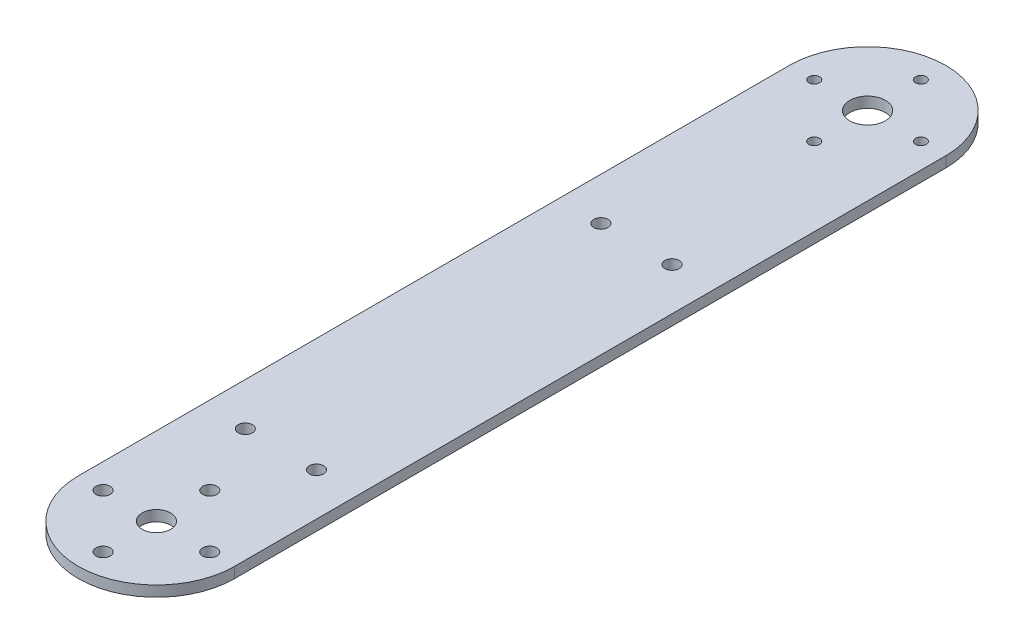
ISO-10303-21;
HEADER;
FILE_DESCRIPTION(('STEP AP214'),'2;1');
FILE_NAME('part.step','',(''),(''),'','','');
FILE_SCHEMA(('AUTOMOTIVE_DESIGN { 1 0 10303 214 1 1 1 1 }'));
ENDSEC;
DATA;
#1=APPLICATION_CONTEXT('core data for automotive mechanical design processes');
#2=APPLICATION_PROTOCOL_DEFINITION('international standard','automotive_design',2000,#1);
#3=PRODUCT_CONTEXT('',#1,'mechanical');
#4=PRODUCT('Part','Part','',(#3));
#5=PRODUCT_RELATED_PRODUCT_CATEGORY('part','',(#4));
#6=PRODUCT_DEFINITION_FORMATION('','',#4);
#7=PRODUCT_DEFINITION_CONTEXT('part definition',#1,'design');
#8=PRODUCT_DEFINITION('design','',#6,#7);
#9=PRODUCT_DEFINITION_SHAPE('','',#8);
#10=(LENGTH_UNIT() NAMED_UNIT(*) SI_UNIT(.MILLI.,.METRE.));
#11=(NAMED_UNIT(*) PLANE_ANGLE_UNIT() SI_UNIT($,.RADIAN.));
#12=(NAMED_UNIT(*) SI_UNIT($,.STERADIAN.) SOLID_ANGLE_UNIT());
#13=UNCERTAINTY_MEASURE_WITH_UNIT(LENGTH_MEASURE(1.E-05),#10,'distance_accuracy_value','');
#14=(GEOMETRIC_REPRESENTATION_CONTEXT(3) GLOBAL_UNCERTAINTY_ASSIGNED_CONTEXT((#13)) GLOBAL_UNIT_ASSIGNED_CONTEXT((#10,
#11,#12)) REPRESENTATION_CONTEXT('',''));
#15=CARTESIAN_POINT('',(0.,0.,0.));
#16=DIRECTION('',(0.,0.,1.));
#17=DIRECTION('',(1.,0.,0.));
#18=AXIS2_PLACEMENT_3D('',#15,#16,#17);
#19=CARTESIAN_POINT('',(0.,-3.,-200.));
#20=DIRECTION('',(0.,1.,0.));
#21=DIRECTION('',(0.,0.,1.));
#22=AXIS2_PLACEMENT_3D('',#19,#20,#21);
#23=CYLINDRICAL_SURFACE('',#22,22.);
#24=CARTESIAN_POINT('',(0.,0.,-200.));
#25=DIRECTION('',(0.,1.,0.));
#26=DIRECTION('',(0.,0.,1.));
#27=AXIS2_PLACEMENT_3D('',#24,#25,#26);
#28=CIRCLE('',#27,22.);
#29=CARTESIAN_POINT('',(22.,0.,-200.));
#30=VERTEX_POINT('',#29);
#31=CARTESIAN_POINT('',(-22.,0.,-200.));
#32=VERTEX_POINT('',#31);
#33=EDGE_CURVE('E101',#30,#32,#28,.T.);
#34=ORIENTED_EDGE('',*,*,#33,.F.);
#35=DIRECTION('',(0.,1.,0.));
#36=VECTOR('',#35,1.);
#37=CARTESIAN_POINT('',(22.,-3.,-200.));
#38=LINE('',#37,#36);
#39=CARTESIAN_POINT('',(22.,-3.,-200.));
#40=VERTEX_POINT('',#39);
#41=EDGE_CURVE('E11',#40,#30,#38,.T.);
#42=ORIENTED_EDGE('',*,*,#41,.F.);
#43=CARTESIAN_POINT('',(0.,-3.,-200.));
#44=DIRECTION('',(0.,1.,0.));
#45=DIRECTION('',(0.,0.,1.));
#46=AXIS2_PLACEMENT_3D('',#43,#44,#45);
#47=CIRCLE('',#46,22.);
#48=CARTESIAN_POINT('',(-22.,-3.,-200.));
#49=VERTEX_POINT('',#48);
#50=EDGE_CURVE('E94',#40,#49,#47,.T.);
#51=ORIENTED_EDGE('',*,*,#50,.T.);
#52=DIRECTION('',(0.,1.,0.));
#53=VECTOR('',#52,1.);
#54=CARTESIAN_POINT('',(-22.,-3.,-200.));
#55=LINE('',#54,#53);
#56=EDGE_CURVE('E39',#49,#32,#55,.T.);
#57=ORIENTED_EDGE('',*,*,#56,.T.);
#58=EDGE_LOOP('',(#34,#42,#51,#57));
#59=FACE_BOUND('',#58,.T.);
#60=ADVANCED_FACE('F36',(#59),#23,.T.);
#61=CARTESIAN_POINT('',(22.,-3.,-200.));
#62=DIRECTION('',(1.,0.,0.));
#63=DIRECTION('',(0.,0.,-1.));
#64=AXIS2_PLACEMENT_3D('',#61,#62,#63);
#65=PLANE('',#64);
#66=DIRECTION('',(0.,0.,-1.));
#67=VECTOR('',#66,1.);
#68=CARTESIAN_POINT('',(22.,0.,-200.));
#69=LINE('',#68,#67);
#70=CARTESIAN_POINT('',(22.,0.,0.));
#71=VERTEX_POINT('',#70);
#72=EDGE_CURVE('E96',#71,#30,#69,.T.);
#73=ORIENTED_EDGE('',*,*,#72,.F.);
#74=DIRECTION('',(0.,1.,0.));
#75=VECTOR('',#74,1.);
#76=CARTESIAN_POINT('',(22.,-3.,0.));
#77=LINE('',#76,#75);
#78=CARTESIAN_POINT('',(22.,-3.,0.));
#79=VERTEX_POINT('',#78);
#80=EDGE_CURVE('E45',#79,#71,#77,.T.);
#81=ORIENTED_EDGE('',*,*,#80,.F.);
#82=DIRECTION('',(0.,0.,-1.));
#83=VECTOR('',#82,1.);
#84=CARTESIAN_POINT('',(22.,-3.,-200.));
#85=LINE('',#84,#83);
#86=EDGE_CURVE('E91',#79,#40,#85,.T.);
#87=ORIENTED_EDGE('',*,*,#86,.T.);
#88=ORIENTED_EDGE('',*,*,#41,.T.);
#89=EDGE_LOOP('',(#73,#81,#87,#88));
#90=FACE_BOUND('',#89,.T.);
#91=ADVANCED_FACE('F112',(#90),#65,.T.);
#92=CARTESIAN_POINT('',(0.,-3.,0.));
#93=DIRECTION('',(0.,1.,0.));
#94=DIRECTION('',(0.,0.,1.));
#95=AXIS2_PLACEMENT_3D('',#92,#93,#94);
#96=CYLINDRICAL_SURFACE('',#95,22.);
#97=CARTESIAN_POINT('',(0.,0.,0.));
#98=DIRECTION('',(0.,1.,0.));
#99=DIRECTION('',(0.,0.,1.));
#100=AXIS2_PLACEMENT_3D('',#97,#98,#99);
#101=CIRCLE('',#100,22.);
#102=CARTESIAN_POINT('',(-22.,0.,0.));
#103=VERTEX_POINT('',#102);
#104=EDGE_CURVE('E86',#103,#71,#101,.T.);
#105=ORIENTED_EDGE('',*,*,#104,.F.);
#106=DIRECTION('',(0.,1.,0.));
#107=VECTOR('',#106,1.);
#108=CARTESIAN_POINT('',(-22.,-3.,0.));
#109=LINE('',#108,#107);
#110=CARTESIAN_POINT('',(-22.,-3.,0.));
#111=VERTEX_POINT('',#110);
#112=EDGE_CURVE('E81',#111,#103,#109,.T.);
#113=ORIENTED_EDGE('',*,*,#112,.F.);
#114=CARTESIAN_POINT('',(0.,-3.,0.));
#115=DIRECTION('',(0.,1.,0.));
#116=DIRECTION('',(0.,0.,1.));
#117=AXIS2_PLACEMENT_3D('',#114,#115,#116);
#118=CIRCLE('',#117,22.);
#119=EDGE_CURVE('E84',#111,#79,#118,.T.);
#120=ORIENTED_EDGE('',*,*,#119,.T.);
#121=ORIENTED_EDGE('',*,*,#80,.T.);
#122=EDGE_LOOP('',(#105,#113,#120,#121));
#123=FACE_BOUND('',#122,.T.);
#124=ADVANCED_FACE('F83',(#123),#96,.T.);
#125=CARTESIAN_POINT('',(-22.,-3.,0.));
#126=DIRECTION('',(-1.,0.,0.));
#127=DIRECTION('',(0.,0.,1.));
#128=AXIS2_PLACEMENT_3D('',#125,#126,#127);
#129=PLANE('',#128);
#130=DIRECTION('',(0.,0.,1.));
#131=VECTOR('',#130,1.);
#132=CARTESIAN_POINT('',(-22.,0.,0.));
#133=LINE('',#132,#131);
#134=EDGE_CURVE('E104',#32,#103,#133,.T.);
#135=ORIENTED_EDGE('',*,*,#134,.F.);
#136=ORIENTED_EDGE('',*,*,#56,.F.);
#137=DIRECTION('',(0.,0.,1.));
#138=VECTOR('',#137,1.);
#139=CARTESIAN_POINT('',(-22.,-3.,0.));
#140=LINE('',#139,#138);
#141=EDGE_CURVE('E90',#49,#111,#140,.T.);
#142=ORIENTED_EDGE('',*,*,#141,.T.);
#143=ORIENTED_EDGE('',*,*,#112,.T.);
#144=EDGE_LOOP('',(#135,#136,#142,#143));
#145=FACE_BOUND('',#144,.T.);
#146=ADVANCED_FACE('F93',(#145),#129,.T.);
#147=CARTESIAN_POINT('',(0.,-3.,-200.));
#148=DIRECTION('',(0.,1.,0.));
#149=DIRECTION('',(0.,0.,1.));
#150=AXIS2_PLACEMENT_3D('',#147,#148,#149);
#151=PLANE('',#150);
#152=CARTESIAN_POINT('',(-15.,-3.,-1.57116660247941E-13));
#153=DIRECTION('',(0.,1.,0.));
#154=DIRECTION('',(0.,0.,1.));
#155=AXIS2_PLACEMENT_3D('',#152,#153,#154);
#156=CIRCLE('',#155,2.);
#157=CARTESIAN_POINT('',(-15.,-3.,1.99999999999984));
#158=VERTEX_POINT('',#157);
#159=EDGE_CURVE('E193',#158,#158,#156,.T.);
#160=ORIENTED_EDGE('',*,*,#159,.T.);
#161=EDGE_LOOP('',(#160));
#162=FACE_BOUND('',#161,.T.);
#163=CARTESIAN_POINT('',(-1.04744440165294E-13,-3.,15.));
#164=DIRECTION('',(0.,1.,0.));
#165=DIRECTION('',(0.,0.,1.));
#166=AXIS2_PLACEMENT_3D('',#163,#164,#165);
#167=CIRCLE('',#166,2.);
#168=CARTESIAN_POINT('',(-1.04744440165294E-13,-3.,17.));
#169=VERTEX_POINT('',#168);
#170=EDGE_CURVE('E201',#169,#169,#167,.T.);
#171=ORIENTED_EDGE('',*,*,#170,.T.);
#172=EDGE_LOOP('',(#171));
#173=FACE_BOUND('',#172,.T.);
#174=CARTESIAN_POINT('',(15.,-3.,0.));
#175=DIRECTION('',(0.,1.,0.));
#176=DIRECTION('',(0.,0.,1.));
#177=AXIS2_PLACEMENT_3D('',#174,#175,#176);
#178=CIRCLE('',#177,2.);
#179=CARTESIAN_POINT('',(15.,-3.,2.00000000000005));
#180=VERTEX_POINT('',#179);
#181=EDGE_CURVE('E207',#180,#180,#178,.T.);
#182=ORIENTED_EDGE('',*,*,#181,.T.);
#183=EDGE_LOOP('',(#182));
#184=FACE_BOUND('',#183,.T.);
#185=CARTESIAN_POINT('',(-14.9999999999996,-3.,-200.));
#186=DIRECTION('',(0.,1.,0.));
#187=DIRECTION('',(0.,0.,1.));
#188=AXIS2_PLACEMENT_3D('',#185,#186,#187);
#189=CIRCLE('',#188,1.49999999999999);
#190=CARTESIAN_POINT('',(-14.9999999999996,-3.,-198.5));
#191=VERTEX_POINT('',#190);
#192=EDGE_CURVE('E213',#191,#191,#189,.T.);
#193=ORIENTED_EDGE('',*,*,#192,.T.);
#194=EDGE_LOOP('',(#193));
#195=FACE_BOUND('',#194,.T.);
#196=CARTESIAN_POINT('',(7.42954120482731E-13,-3.,-185.));
#197=DIRECTION('',(0.,1.,0.));
#198=DIRECTION('',(0.,0.,1.));
#199=AXIS2_PLACEMENT_3D('',#196,#197,#198);
#200=CIRCLE('',#199,1.5);
#201=CARTESIAN_POINT('',(7.42954120482731E-13,-3.,-183.5));
#202=VERTEX_POINT('',#201);
#203=EDGE_CURVE('E219',#202,#202,#200,.T.);
#204=ORIENTED_EDGE('',*,*,#203,.T.);
#205=EDGE_LOOP('',(#204));
#206=FACE_BOUND('',#205,.T.);
#207=CARTESIAN_POINT('',(15.0000000000004,-3.,-200.));
#208=DIRECTION('',(0.,1.,0.));
#209=DIRECTION('',(0.,0.,1.));
#210=AXIS2_PLACEMENT_3D('',#207,#208,#209);
#211=CIRCLE('',#210,1.5);
#212=CARTESIAN_POINT('',(15.0000000000004,-3.,-198.5));
#213=VERTEX_POINT('',#212);
#214=EDGE_CURVE('E225',#213,#213,#211,.T.);
#215=ORIENTED_EDGE('',*,*,#214,.T.);
#216=EDGE_LOOP('',(#215));
#217=FACE_BOUND('',#216,.T.);
#218=CARTESIAN_POINT('',(0.,-3.,-15.));
#219=DIRECTION('',(0.,1.,0.));
#220=DIRECTION('',(0.,0.,1.));
#221=AXIS2_PLACEMENT_3D('',#218,#219,#220);
#222=CIRCLE('',#221,2.);
#223=CARTESIAN_POINT('',(0.,-3.,-13.));
#224=VERTEX_POINT('',#223);
#225=EDGE_CURVE('E231',#224,#224,#222,.T.);
#226=ORIENTED_EDGE('',*,*,#225,.T.);
#227=EDGE_LOOP('',(#226));
#228=FACE_BOUND('',#227,.T.);
#229=CARTESIAN_POINT('',(0.,-3.,-215.));
#230=DIRECTION('',(0.,1.,0.));
#231=DIRECTION('',(0.,0.,1.));
#232=AXIS2_PLACEMENT_3D('',#229,#230,#231);
#233=CIRCLE('',#232,1.5);
#234=CARTESIAN_POINT('',(0.,-3.,-213.5));
#235=VERTEX_POINT('',#234);
#236=EDGE_CURVE('E237',#235,#235,#233,.T.);
#237=ORIENTED_EDGE('',*,*,#236,.T.);
#238=EDGE_LOOP('',(#237));
#239=FACE_BOUND('',#238,.T.);
#240=CARTESIAN_POINT('',(0.,-3.,-200.));
#241=DIRECTION('',(0.,1.,0.));
#242=DIRECTION('',(0.,0.,1.));
#243=AXIS2_PLACEMENT_3D('',#240,#241,#242);
#244=CIRCLE('',#243,5.);
#245=CARTESIAN_POINT('',(0.,-3.,-195.));
#246=VERTEX_POINT('',#245);
#247=EDGE_CURVE('E243',#246,#246,#244,.T.);
#248=ORIENTED_EDGE('',*,*,#247,.T.);
#249=EDGE_LOOP('',(#248));
#250=FACE_BOUND('',#249,.T.);
#251=CARTESIAN_POINT('',(9.99999999999999,-3.,-135.));
#252=DIRECTION('',(0.,1.,0.));
#253=DIRECTION('',(0.,0.,1.));
#254=AXIS2_PLACEMENT_3D('',#251,#252,#253);
#255=CIRCLE('',#254,2.);
#256=CARTESIAN_POINT('',(9.99999999999999,-3.,-133.));
#257=VERTEX_POINT('',#256);
#258=EDGE_CURVE('E249',#257,#257,#255,.T.);
#259=ORIENTED_EDGE('',*,*,#258,.T.);
#260=EDGE_LOOP('',(#259));
#261=FACE_BOUND('',#260,.T.);
#262=CARTESIAN_POINT('',(-10.,-3.,-135.));
#263=DIRECTION('',(0.,1.,0.));
#264=DIRECTION('',(0.,0.,1.));
#265=AXIS2_PLACEMENT_3D('',#262,#263,#264);
#266=CIRCLE('',#265,2.);
#267=CARTESIAN_POINT('',(-10.,-3.,-133.));
#268=VERTEX_POINT('',#267);
#269=EDGE_CURVE('E255',#268,#268,#266,.T.);
#270=ORIENTED_EDGE('',*,*,#269,.T.);
#271=EDGE_LOOP('',(#270));
#272=FACE_BOUND('',#271,.T.);
#273=CARTESIAN_POINT('',(10.,-3.,-35.));
#274=DIRECTION('',(0.,1.,0.));
#275=DIRECTION('',(0.,0.,1.));
#276=AXIS2_PLACEMENT_3D('',#273,#274,#275);
#277=CIRCLE('',#276,2.);
#278=CARTESIAN_POINT('',(10.,-3.,-33.));
#279=VERTEX_POINT('',#278);
#280=EDGE_CURVE('E261',#279,#279,#277,.T.);
#281=ORIENTED_EDGE('',*,*,#280,.T.);
#282=EDGE_LOOP('',(#281));
#283=FACE_BOUND('',#282,.T.);
#284=CARTESIAN_POINT('',(-10.,-3.,-35.));
#285=DIRECTION('',(0.,1.,0.));
#286=DIRECTION('',(0.,0.,1.));
#287=AXIS2_PLACEMENT_3D('',#284,#285,#286);
#288=CIRCLE('',#287,2.);
#289=CARTESIAN_POINT('',(-10.,-3.,-33.));
#290=VERTEX_POINT('',#289);
#291=EDGE_CURVE('E267',#290,#290,#288,.T.);
#292=ORIENTED_EDGE('',*,*,#291,.T.);
#293=EDGE_LOOP('',(#292));
#294=FACE_BOUND('',#293,.T.);
#295=CARTESIAN_POINT('',(0.,-3.,0.));
#296=DIRECTION('',(0.,1.,0.));
#297=DIRECTION('',(0.,0.,1.));
#298=AXIS2_PLACEMENT_3D('',#295,#296,#297);
#299=CIRCLE('',#298,4.);
#300=CARTESIAN_POINT('',(0.,-3.,4.));
#301=VERTEX_POINT('',#300);
#302=EDGE_CURVE('E105',#301,#301,#299,.T.);
#303=ORIENTED_EDGE('',*,*,#302,.T.);
#304=EDGE_LOOP('',(#303));
#305=FACE_BOUND('',#304,.T.);
#306=ORIENTED_EDGE('',*,*,#50,.F.);
#307=ORIENTED_EDGE('',*,*,#86,.F.);
#308=ORIENTED_EDGE('',*,*,#119,.F.);
#309=ORIENTED_EDGE('',*,*,#141,.F.);
#310=EDGE_LOOP('',(#306,#307,#308,#309));
#311=FACE_BOUND('',#310,.T.);
#312=ADVANCED_FACE('F89',(#162,#173,#184,#195,#206,#217,#228,#239,#250,#261,#272,#283,#294,#305,
#311),#151,.F.);
#313=CARTESIAN_POINT('',(0.,0.,-200.));
#314=DIRECTION('',(0.,1.,0.));
#315=DIRECTION('',(0.,0.,1.));
#316=AXIS2_PLACEMENT_3D('',#313,#314,#315);
#317=PLANE('',#316);
#318=CARTESIAN_POINT('',(-15.,0.,-1.57116660247941E-13));
#319=DIRECTION('',(0.,1.,0.));
#320=DIRECTION('',(0.,0.,1.));
#321=AXIS2_PLACEMENT_3D('',#318,#319,#320);
#322=CIRCLE('',#321,2.);
#323=CARTESIAN_POINT('',(-15.,0.,1.99999999999984));
#324=VERTEX_POINT('',#323);
#325=EDGE_CURVE('E196',#324,#324,#322,.T.);
#326=ORIENTED_EDGE('',*,*,#325,.F.);
#327=EDGE_LOOP('',(#326));
#328=FACE_BOUND('',#327,.T.);
#329=CARTESIAN_POINT('',(-1.04744440165294E-13,0.,15.));
#330=DIRECTION('',(0.,1.,0.));
#331=DIRECTION('',(0.,0.,1.));
#332=AXIS2_PLACEMENT_3D('',#329,#330,#331);
#333=CIRCLE('',#332,2.);
#334=CARTESIAN_POINT('',(-1.04744440165294E-13,0.,17.));
#335=VERTEX_POINT('',#334);
#336=EDGE_CURVE('E198',#335,#335,#333,.T.);
#337=ORIENTED_EDGE('',*,*,#336,.F.);
#338=EDGE_LOOP('',(#337));
#339=FACE_BOUND('',#338,.T.);
#340=CARTESIAN_POINT('',(15.,0.,0.));
#341=DIRECTION('',(0.,1.,0.));
#342=DIRECTION('',(0.,0.,1.));
#343=AXIS2_PLACEMENT_3D('',#340,#341,#342);
#344=CIRCLE('',#343,2.);
#345=CARTESIAN_POINT('',(15.,0.,2.00000000000005));
#346=VERTEX_POINT('',#345);
#347=EDGE_CURVE('E204',#346,#346,#344,.T.);
#348=ORIENTED_EDGE('',*,*,#347,.F.);
#349=EDGE_LOOP('',(#348));
#350=FACE_BOUND('',#349,.T.);
#351=CARTESIAN_POINT('',(-14.9999999999996,0.,-200.));
#352=DIRECTION('',(0.,1.,0.));
#353=DIRECTION('',(0.,0.,1.));
#354=AXIS2_PLACEMENT_3D('',#351,#352,#353);
#355=CIRCLE('',#354,1.49999999999999);
#356=CARTESIAN_POINT('',(-14.9999999999996,0.,-198.5));
#357=VERTEX_POINT('',#356);
#358=EDGE_CURVE('E210',#357,#357,#355,.T.);
#359=ORIENTED_EDGE('',*,*,#358,.F.);
#360=EDGE_LOOP('',(#359));
#361=FACE_BOUND('',#360,.T.);
#362=CARTESIAN_POINT('',(7.42954120482731E-13,0.,-185.));
#363=DIRECTION('',(0.,1.,0.));
#364=DIRECTION('',(0.,0.,1.));
#365=AXIS2_PLACEMENT_3D('',#362,#363,#364);
#366=CIRCLE('',#365,1.5);
#367=CARTESIAN_POINT('',(7.42954120482731E-13,0.,-183.5));
#368=VERTEX_POINT('',#367);
#369=EDGE_CURVE('E216',#368,#368,#366,.T.);
#370=ORIENTED_EDGE('',*,*,#369,.F.);
#371=EDGE_LOOP('',(#370));
#372=FACE_BOUND('',#371,.T.);
#373=CARTESIAN_POINT('',(15.0000000000004,0.,-200.));
#374=DIRECTION('',(0.,1.,0.));
#375=DIRECTION('',(0.,0.,1.));
#376=AXIS2_PLACEMENT_3D('',#373,#374,#375);
#377=CIRCLE('',#376,1.5);
#378=CARTESIAN_POINT('',(15.0000000000004,0.,-198.5));
#379=VERTEX_POINT('',#378);
#380=EDGE_CURVE('E222',#379,#379,#377,.T.);
#381=ORIENTED_EDGE('',*,*,#380,.F.);
#382=EDGE_LOOP('',(#381));
#383=FACE_BOUND('',#382,.T.);
#384=CARTESIAN_POINT('',(0.,0.,-15.));
#385=DIRECTION('',(0.,1.,0.));
#386=DIRECTION('',(0.,0.,1.));
#387=AXIS2_PLACEMENT_3D('',#384,#385,#386);
#388=CIRCLE('',#387,2.);
#389=CARTESIAN_POINT('',(0.,0.,-13.));
#390=VERTEX_POINT('',#389);
#391=EDGE_CURVE('E228',#390,#390,#388,.T.);
#392=ORIENTED_EDGE('',*,*,#391,.F.);
#393=EDGE_LOOP('',(#392));
#394=FACE_BOUND('',#393,.T.);
#395=CARTESIAN_POINT('',(0.,0.,-215.));
#396=DIRECTION('',(0.,1.,0.));
#397=DIRECTION('',(0.,0.,1.));
#398=AXIS2_PLACEMENT_3D('',#395,#396,#397);
#399=CIRCLE('',#398,1.5);
#400=CARTESIAN_POINT('',(0.,0.,-213.5));
#401=VERTEX_POINT('',#400);
#402=EDGE_CURVE('E234',#401,#401,#399,.T.);
#403=ORIENTED_EDGE('',*,*,#402,.F.);
#404=EDGE_LOOP('',(#403));
#405=FACE_BOUND('',#404,.T.);
#406=CARTESIAN_POINT('',(0.,0.,-200.));
#407=DIRECTION('',(0.,1.,0.));
#408=DIRECTION('',(0.,0.,1.));
#409=AXIS2_PLACEMENT_3D('',#406,#407,#408);
#410=CIRCLE('',#409,5.);
#411=CARTESIAN_POINT('',(0.,0.,-195.));
#412=VERTEX_POINT('',#411);
#413=EDGE_CURVE('E240',#412,#412,#410,.T.);
#414=ORIENTED_EDGE('',*,*,#413,.F.);
#415=EDGE_LOOP('',(#414));
#416=FACE_BOUND('',#415,.T.);
#417=CARTESIAN_POINT('',(9.99999999999999,0.,-135.));
#418=DIRECTION('',(0.,1.,0.));
#419=DIRECTION('',(0.,0.,1.));
#420=AXIS2_PLACEMENT_3D('',#417,#418,#419);
#421=CIRCLE('',#420,2.);
#422=CARTESIAN_POINT('',(9.99999999999999,0.,-133.));
#423=VERTEX_POINT('',#422);
#424=EDGE_CURVE('E246',#423,#423,#421,.T.);
#425=ORIENTED_EDGE('',*,*,#424,.F.);
#426=EDGE_LOOP('',(#425));
#427=FACE_BOUND('',#426,.T.);
#428=CARTESIAN_POINT('',(-10.,0.,-135.));
#429=DIRECTION('',(0.,1.,0.));
#430=DIRECTION('',(0.,0.,1.));
#431=AXIS2_PLACEMENT_3D('',#428,#429,#430);
#432=CIRCLE('',#431,2.);
#433=CARTESIAN_POINT('',(-10.,0.,-133.));
#434=VERTEX_POINT('',#433);
#435=EDGE_CURVE('E252',#434,#434,#432,.T.);
#436=ORIENTED_EDGE('',*,*,#435,.F.);
#437=EDGE_LOOP('',(#436));
#438=FACE_BOUND('',#437,.T.);
#439=CARTESIAN_POINT('',(10.,0.,-35.));
#440=DIRECTION('',(0.,1.,0.));
#441=DIRECTION('',(0.,0.,1.));
#442=AXIS2_PLACEMENT_3D('',#439,#440,#441);
#443=CIRCLE('',#442,2.);
#444=CARTESIAN_POINT('',(10.,0.,-33.));
#445=VERTEX_POINT('',#444);
#446=EDGE_CURVE('E258',#445,#445,#443,.T.);
#447=ORIENTED_EDGE('',*,*,#446,.F.);
#448=EDGE_LOOP('',(#447));
#449=FACE_BOUND('',#448,.T.);
#450=CARTESIAN_POINT('',(-10.,0.,-35.));
#451=DIRECTION('',(0.,1.,0.));
#452=DIRECTION('',(0.,0.,1.));
#453=AXIS2_PLACEMENT_3D('',#450,#451,#452);
#454=CIRCLE('',#453,2.);
#455=CARTESIAN_POINT('',(-10.,0.,-33.));
#456=VERTEX_POINT('',#455);
#457=EDGE_CURVE('E264',#456,#456,#454,.T.);
#458=ORIENTED_EDGE('',*,*,#457,.F.);
#459=EDGE_LOOP('',(#458));
#460=FACE_BOUND('',#459,.T.);
#461=CARTESIAN_POINT('',(0.,0.,0.));
#462=DIRECTION('',(0.,1.,0.));
#463=DIRECTION('',(0.,0.,1.));
#464=AXIS2_PLACEMENT_3D('',#461,#462,#463);
#465=CIRCLE('',#464,4.);
#466=CARTESIAN_POINT('',(0.,0.,4.));
#467=VERTEX_POINT('',#466);
#468=EDGE_CURVE('E270',#467,#467,#465,.T.);
#469=ORIENTED_EDGE('',*,*,#468,.F.);
#470=EDGE_LOOP('',(#469));
#471=FACE_BOUND('',#470,.T.);
#472=ORIENTED_EDGE('',*,*,#33,.T.);
#473=ORIENTED_EDGE('',*,*,#134,.T.);
#474=ORIENTED_EDGE('',*,*,#104,.T.);
#475=ORIENTED_EDGE('',*,*,#72,.T.);
#476=EDGE_LOOP('',(#472,#473,#474,#475));
#477=FACE_BOUND('',#476,.T.);
#478=ADVANCED_FACE('F111',(#328,#339,#350,#361,#372,#383,#394,#405,#416,#427,#438,#449,#460,
#471,#477),#317,.T.);
#479=CARTESIAN_POINT('',(0.,-3.,0.));
#480=DIRECTION('',(0.,1.,0.));
#481=DIRECTION('',(0.,0.,1.));
#482=AXIS2_PLACEMENT_3D('',#479,#480,#481);
#483=CYLINDRICAL_SURFACE('',#482,4.);
#484=ORIENTED_EDGE('',*,*,#302,.F.);
#485=EDGE_LOOP('',(#484));
#486=FACE_BOUND('',#485,.T.);
#487=ORIENTED_EDGE('',*,*,#468,.T.);
#488=EDGE_LOOP('',(#487));
#489=FACE_BOUND('',#488,.T.);
#490=ADVANCED_FACE('F130',(#486,#489),#483,.F.);
#491=CARTESIAN_POINT('',(-10.,-3.,-35.));
#492=DIRECTION('',(0.,1.,0.));
#493=DIRECTION('',(0.,0.,1.));
#494=AXIS2_PLACEMENT_3D('',#491,#492,#493);
#495=CYLINDRICAL_SURFACE('',#494,2.);
#496=ORIENTED_EDGE('',*,*,#291,.F.);
#497=EDGE_LOOP('',(#496));
#498=FACE_BOUND('',#497,.T.);
#499=ORIENTED_EDGE('',*,*,#457,.T.);
#500=EDGE_LOOP('',(#499));
#501=FACE_BOUND('',#500,.T.);
#502=ADVANCED_FACE('F137',(#498,#501),#495,.F.);
#503=CARTESIAN_POINT('',(10.,-3.,-35.));
#504=DIRECTION('',(0.,1.,0.));
#505=DIRECTION('',(0.,0.,1.));
#506=AXIS2_PLACEMENT_3D('',#503,#504,#505);
#507=CYLINDRICAL_SURFACE('',#506,2.);
#508=ORIENTED_EDGE('',*,*,#280,.F.);
#509=EDGE_LOOP('',(#508));
#510=FACE_BOUND('',#509,.T.);
#511=ORIENTED_EDGE('',*,*,#446,.T.);
#512=EDGE_LOOP('',(#511));
#513=FACE_BOUND('',#512,.T.);
#514=ADVANCED_FACE('F141',(#510,#513),#507,.F.);
#515=CARTESIAN_POINT('',(-10.,-3.,-135.));
#516=DIRECTION('',(0.,1.,0.));
#517=DIRECTION('',(0.,0.,1.));
#518=AXIS2_PLACEMENT_3D('',#515,#516,#517);
#519=CYLINDRICAL_SURFACE('',#518,2.);
#520=ORIENTED_EDGE('',*,*,#269,.F.);
#521=EDGE_LOOP('',(#520));
#522=FACE_BOUND('',#521,.T.);
#523=ORIENTED_EDGE('',*,*,#435,.T.);
#524=EDGE_LOOP('',(#523));
#525=FACE_BOUND('',#524,.T.);
#526=ADVANCED_FACE('F145',(#522,#525),#519,.F.);
#527=CARTESIAN_POINT('',(9.99999999999999,-3.,-135.));
#528=DIRECTION('',(0.,1.,0.));
#529=DIRECTION('',(0.,0.,1.));
#530=AXIS2_PLACEMENT_3D('',#527,#528,#529);
#531=CYLINDRICAL_SURFACE('',#530,2.);
#532=ORIENTED_EDGE('',*,*,#258,.F.);
#533=EDGE_LOOP('',(#532));
#534=FACE_BOUND('',#533,.T.);
#535=ORIENTED_EDGE('',*,*,#424,.T.);
#536=EDGE_LOOP('',(#535));
#537=FACE_BOUND('',#536,.T.);
#538=ADVANCED_FACE('F149',(#534,#537),#531,.F.);
#539=CARTESIAN_POINT('',(0.,-3.,-200.));
#540=DIRECTION('',(0.,1.,0.));
#541=DIRECTION('',(0.,0.,1.));
#542=AXIS2_PLACEMENT_3D('',#539,#540,#541);
#543=CYLINDRICAL_SURFACE('',#542,5.);
#544=ORIENTED_EDGE('',*,*,#247,.F.);
#545=EDGE_LOOP('',(#544));
#546=FACE_BOUND('',#545,.T.);
#547=ORIENTED_EDGE('',*,*,#413,.T.);
#548=EDGE_LOOP('',(#547));
#549=FACE_BOUND('',#548,.T.);
#550=ADVANCED_FACE('F153',(#546,#549),#543,.F.);
#551=CARTESIAN_POINT('',(0.,-3.,-215.));
#552=DIRECTION('',(0.,1.,0.));
#553=DIRECTION('',(0.,0.,1.));
#554=AXIS2_PLACEMENT_3D('',#551,#552,#553);
#555=CYLINDRICAL_SURFACE('',#554,1.5);
#556=ORIENTED_EDGE('',*,*,#236,.F.);
#557=EDGE_LOOP('',(#556));
#558=FACE_BOUND('',#557,.T.);
#559=ORIENTED_EDGE('',*,*,#402,.T.);
#560=EDGE_LOOP('',(#559));
#561=FACE_BOUND('',#560,.T.);
#562=ADVANCED_FACE('F157',(#558,#561),#555,.F.);
#563=CARTESIAN_POINT('',(0.,-3.,-15.));
#564=DIRECTION('',(0.,1.,0.));
#565=DIRECTION('',(0.,0.,1.));
#566=AXIS2_PLACEMENT_3D('',#563,#564,#565);
#567=CYLINDRICAL_SURFACE('',#566,2.);
#568=ORIENTED_EDGE('',*,*,#225,.F.);
#569=EDGE_LOOP('',(#568));
#570=FACE_BOUND('',#569,.T.);
#571=ORIENTED_EDGE('',*,*,#391,.T.);
#572=EDGE_LOOP('',(#571));
#573=FACE_BOUND('',#572,.T.);
#574=ADVANCED_FACE('F161',(#570,#573),#567,.F.);
#575=CARTESIAN_POINT('',(15.0000000000004,-3.,-200.));
#576=DIRECTION('',(0.,1.,0.));
#577=DIRECTION('',(0.,0.,1.));
#578=AXIS2_PLACEMENT_3D('',#575,#576,#577);
#579=CYLINDRICAL_SURFACE('',#578,1.5);
#580=ORIENTED_EDGE('',*,*,#214,.F.);
#581=EDGE_LOOP('',(#580));
#582=FACE_BOUND('',#581,.T.);
#583=ORIENTED_EDGE('',*,*,#380,.T.);
#584=EDGE_LOOP('',(#583));
#585=FACE_BOUND('',#584,.T.);
#586=ADVANCED_FACE('F165',(#582,#585),#579,.F.);
#587=CARTESIAN_POINT('',(7.42954120482731E-13,-3.,-185.));
#588=DIRECTION('',(0.,1.,0.));
#589=DIRECTION('',(0.,0.,1.));
#590=AXIS2_PLACEMENT_3D('',#587,#588,#589);
#591=CYLINDRICAL_SURFACE('',#590,1.5);
#592=ORIENTED_EDGE('',*,*,#203,.F.);
#593=EDGE_LOOP('',(#592));
#594=FACE_BOUND('',#593,.T.);
#595=ORIENTED_EDGE('',*,*,#369,.T.);
#596=EDGE_LOOP('',(#595));
#597=FACE_BOUND('',#596,.T.);
#598=ADVANCED_FACE('F169',(#594,#597),#591,.F.);
#599=CARTESIAN_POINT('',(-14.9999999999996,-3.,-200.));
#600=DIRECTION('',(0.,1.,0.));
#601=DIRECTION('',(0.,0.,1.));
#602=AXIS2_PLACEMENT_3D('',#599,#600,#601);
#603=CYLINDRICAL_SURFACE('',#602,1.49999999999999);
#604=ORIENTED_EDGE('',*,*,#192,.F.);
#605=EDGE_LOOP('',(#604));
#606=FACE_BOUND('',#605,.T.);
#607=ORIENTED_EDGE('',*,*,#358,.T.);
#608=EDGE_LOOP('',(#607));
#609=FACE_BOUND('',#608,.T.);
#610=ADVANCED_FACE('F173',(#606,#609),#603,.F.);
#611=CARTESIAN_POINT('',(15.,-3.,0.));
#612=DIRECTION('',(0.,1.,0.));
#613=DIRECTION('',(0.,0.,1.));
#614=AXIS2_PLACEMENT_3D('',#611,#612,#613);
#615=CYLINDRICAL_SURFACE('',#614,2.);
#616=ORIENTED_EDGE('',*,*,#181,.F.);
#617=EDGE_LOOP('',(#616));
#618=FACE_BOUND('',#617,.T.);
#619=ORIENTED_EDGE('',*,*,#347,.T.);
#620=EDGE_LOOP('',(#619));
#621=FACE_BOUND('',#620,.T.);
#622=ADVANCED_FACE('F177',(#618,#621),#615,.F.);
#623=CARTESIAN_POINT('',(-1.04744440165294E-13,-3.,15.));
#624=DIRECTION('',(0.,1.,0.));
#625=DIRECTION('',(0.,0.,1.));
#626=AXIS2_PLACEMENT_3D('',#623,#624,#625);
#627=CYLINDRICAL_SURFACE('',#626,2.);
#628=ORIENTED_EDGE('',*,*,#170,.F.);
#629=EDGE_LOOP('',(#628));
#630=FACE_BOUND('',#629,.T.);
#631=ORIENTED_EDGE('',*,*,#336,.T.);
#632=EDGE_LOOP('',(#631));
#633=FACE_BOUND('',#632,.T.);
#634=ADVANCED_FACE('F181',(#630,#633),#627,.F.);
#635=CARTESIAN_POINT('',(-15.,-3.,-1.57116660247941E-13));
#636=DIRECTION('',(0.,1.,0.));
#637=DIRECTION('',(0.,0.,1.));
#638=AXIS2_PLACEMENT_3D('',#635,#636,#637);
#639=CYLINDRICAL_SURFACE('',#638,2.);
#640=ORIENTED_EDGE('',*,*,#159,.F.);
#641=EDGE_LOOP('',(#640));
#642=FACE_BOUND('',#641,.T.);
#643=ORIENTED_EDGE('',*,*,#325,.T.);
#644=EDGE_LOOP('',(#643));
#645=FACE_BOUND('',#644,.T.);
#646=ADVANCED_FACE('F185',(#642,#645),#639,.F.);
#647=CLOSED_SHELL('',(#60,#91,#124,#146,#312,#478,#490,#502,#514,#526,#538,#550,#562,#574,#586,
#598,#610,#622,#634,#646));
#648=MANIFOLD_SOLID_BREP('B2',#647);
#649=ADVANCED_BREP_SHAPE_REPRESENTATION('',(#18,#648),#14);
#650=SHAPE_DEFINITION_REPRESENTATION(#9,#649);
ENDSEC;
END-ISO-10303-21;
